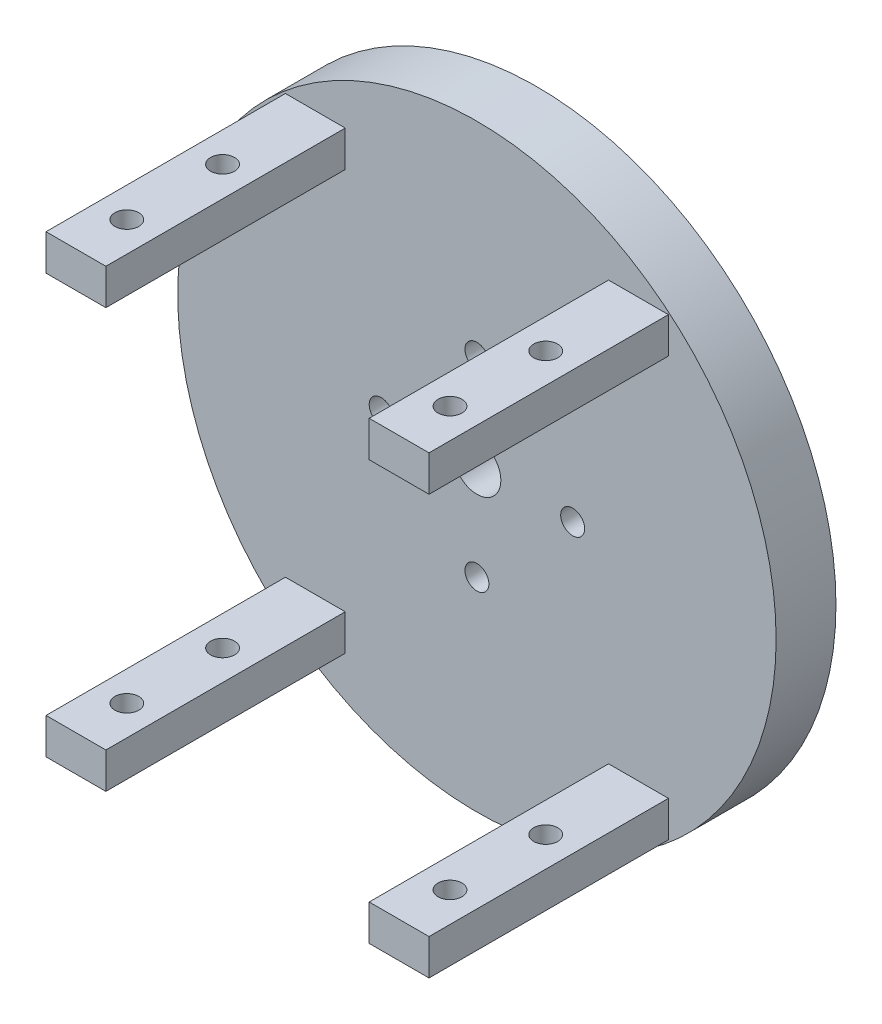
ISO-10303-21;
HEADER;
FILE_DESCRIPTION(('STEP AP214'),'2;1');
FILE_NAME('part.step','',(''),(''),'','','');
FILE_SCHEMA(('AUTOMOTIVE_DESIGN { 1 0 10303 214 1 1 1 1 }'));
ENDSEC;
DATA;
#1=APPLICATION_CONTEXT('core data for automotive mechanical design processes');
#2=APPLICATION_PROTOCOL_DEFINITION('international standard','automotive_design',2000,#1);
#3=PRODUCT_CONTEXT('',#1,'mechanical');
#4=PRODUCT('Part','Part','',(#3));
#5=PRODUCT_RELATED_PRODUCT_CATEGORY('part','',(#4));
#6=PRODUCT_DEFINITION_FORMATION('','',#4);
#7=PRODUCT_DEFINITION_CONTEXT('part definition',#1,'design');
#8=PRODUCT_DEFINITION('design','',#6,#7);
#9=PRODUCT_DEFINITION_SHAPE('','',#8);
#10=(LENGTH_UNIT() NAMED_UNIT(*) SI_UNIT(.MILLI.,.METRE.));
#11=(NAMED_UNIT(*) PLANE_ANGLE_UNIT() SI_UNIT($,.RADIAN.));
#12=(NAMED_UNIT(*) SI_UNIT($,.STERADIAN.) SOLID_ANGLE_UNIT());
#13=UNCERTAINTY_MEASURE_WITH_UNIT(LENGTH_MEASURE(1.E-05),#10,'distance_accuracy_value','');
#14=(GEOMETRIC_REPRESENTATION_CONTEXT(3) GLOBAL_UNCERTAINTY_ASSIGNED_CONTEXT((#13)) GLOBAL_UNIT_ASSIGNED_CONTEXT((#10,
#11,#12)) REPRESENTATION_CONTEXT('',''));
#15=CARTESIAN_POINT('',(0.,0.,0.));
#16=DIRECTION('',(0.,0.,1.));
#17=DIRECTION('',(1.,0.,0.));
#18=AXIS2_PLACEMENT_3D('',#15,#16,#17);
#19=CARTESIAN_POINT('',(2.25414240564596E-13,0.,5.));
#20=DIRECTION('',(0.,0.,1.));
#21=DIRECTION('',(1.,0.,0.));
#22=AXIS2_PLACEMENT_3D('',#19,#20,#21);
#23=PLANE('',#22);
#24=CARTESIAN_POINT('',(4.51808198568511E-13,-8.,5.));
#25=DIRECTION('',(0.,0.,1.));
#26=DIRECTION('',(1.,0.,0.));
#27=AXIS2_PLACEMENT_3D('',#24,#25,#26);
#28=CIRCLE('',#27,1.00000000000049);
#29=CARTESIAN_POINT('',(1.00000000000094,-8.,5.));
#30=VERTEX_POINT('',#29);
#31=EDGE_CURVE('E281',#30,#30,#28,.T.);
#32=ORIENTED_EDGE('',*,*,#31,.F.);
#33=EDGE_LOOP('',(#32));
#34=FACE_BOUND('',#33,.T.);
#35=CARTESIAN_POINT('',(0.,8.,5.));
#36=DIRECTION('',(0.,0.,1.));
#37=DIRECTION('',(1.,0.,0.));
#38=AXIS2_PLACEMENT_3D('',#35,#36,#37);
#39=CIRCLE('',#38,1.);
#40=CARTESIAN_POINT('',(1.,8.,5.));
#41=VERTEX_POINT('',#40);
#42=EDGE_CURVE('E293',#41,#41,#39,.T.);
#43=ORIENTED_EDGE('',*,*,#42,.F.);
#44=EDGE_LOOP('',(#43));
#45=FACE_BOUND('',#44,.T.);
#46=CARTESIAN_POINT('',(2.25414240564596E-13,0.,5.));
#47=DIRECTION('',(0.,0.,1.));
#48=DIRECTION('',(1.,0.,0.));
#49=AXIS2_PLACEMENT_3D('',#46,#47,#48);
#50=CIRCLE('',#49,25.);
#51=CARTESIAN_POINT('',(25.0000000000002,0.,5.));
#52=VERTEX_POINT('',#51);
#53=EDGE_CURVE('E11',#52,#52,#50,.T.);
#54=ORIENTED_EDGE('',*,*,#53,.T.);
#55=EDGE_LOOP('',(#54));
#56=FACE_BOUND('',#55,.T.);
#57=CARTESIAN_POINT('',(2.25414240564596E-13,0.,5.));
#58=DIRECTION('',(0.,0.,1.));
#59=DIRECTION('',(1.,0.,0.));
#60=AXIS2_PLACEMENT_3D('',#57,#58,#59);
#61=CIRCLE('',#60,2.);
#62=CARTESIAN_POINT('',(2.00000000000023,0.,5.));
#63=VERTEX_POINT('',#62);
#64=EDGE_CURVE('E299',#63,#63,#61,.T.);
#65=ORIENTED_EDGE('',*,*,#64,.F.);
#66=EDGE_LOOP('',(#65));
#67=FACE_BOUND('',#66,.T.);
#68=CARTESIAN_POINT('',(8.,0.,5.));
#69=DIRECTION('',(0.,0.,1.));
#70=DIRECTION('',(1.,0.,0.));
#71=AXIS2_PLACEMENT_3D('',#68,#69,#70);
#72=CIRCLE('',#71,1.);
#73=CARTESIAN_POINT('',(9.,0.,5.));
#74=VERTEX_POINT('',#73);
#75=EDGE_CURVE('E287',#74,#74,#72,.T.);
#76=ORIENTED_EDGE('',*,*,#75,.F.);
#77=EDGE_LOOP('',(#76));
#78=FACE_BOUND('',#77,.T.);
#79=CARTESIAN_POINT('',(-8.,0.,5.));
#80=DIRECTION('',(0.,0.,1.));
#81=DIRECTION('',(1.,0.,0.));
#82=AXIS2_PLACEMENT_3D('',#79,#80,#81);
#83=CIRCLE('',#82,1.);
#84=CARTESIAN_POINT('',(-7.,0.,5.));
#85=VERTEX_POINT('',#84);
#86=EDGE_CURVE('E275',#85,#85,#83,.T.);
#87=ORIENTED_EDGE('',*,*,#86,.F.);
#88=EDGE_LOOP('',(#87));
#89=FACE_BOUND('',#88,.T.);
#90=DIRECTION('',(1.,0.,0.));
#91=VECTOR('',#90,1.);
#92=CARTESIAN_POINT('',(11.0000000000002,-19.,5.));
#93=LINE('',#92,#91);
#94=CARTESIAN_POINT('',(11.0000000000002,-19.,5.));
#95=VERTEX_POINT('',#94);
#96=CARTESIAN_POINT('',(16.0000000000002,-19.,5.));
#97=VERTEX_POINT('',#96);
#98=EDGE_CURVE('E259',#95,#97,#93,.T.);
#99=ORIENTED_EDGE('',*,*,#98,.F.);
#100=DIRECTION('',(0.,-1.,0.));
#101=VECTOR('',#100,1.);
#102=CARTESIAN_POINT('',(11.0000000000002,-16.,5.));
#103=LINE('',#102,#101);
#104=CARTESIAN_POINT('',(11.0000000000002,-16.,5.));
#105=VERTEX_POINT('',#104);
#106=EDGE_CURVE('E238',#105,#95,#103,.T.);
#107=ORIENTED_EDGE('',*,*,#106,.F.);
#108=DIRECTION('',(-1.,0.,0.));
#109=VECTOR('',#108,1.);
#110=CARTESIAN_POINT('',(11.0000000000002,-16.,5.));
#111=LINE('',#110,#109);
#112=CARTESIAN_POINT('',(16.0000000000002,-16.,5.));
#113=VERTEX_POINT('',#112);
#114=EDGE_CURVE('E250',#113,#105,#111,.T.);
#115=ORIENTED_EDGE('',*,*,#114,.F.);
#116=DIRECTION('',(0.,1.,0.));
#117=VECTOR('',#116,1.);
#118=CARTESIAN_POINT('',(16.0000000000002,-19.,5.));
#119=LINE('',#118,#117);
#120=EDGE_CURVE('E261',#97,#113,#119,.T.);
#121=ORIENTED_EDGE('',*,*,#120,.F.);
#122=EDGE_LOOP('',(#99,#107,#115,#121));
#123=FACE_BOUND('',#122,.T.);
#124=DIRECTION('',(-1.,0.,0.));
#125=VECTOR('',#124,1.);
#126=CARTESIAN_POINT('',(-10.9999999999998,19.,5.));
#127=LINE('',#126,#125);
#128=CARTESIAN_POINT('',(-10.9999999999998,19.,5.));
#129=VERTEX_POINT('',#128);
#130=CARTESIAN_POINT('',(-15.9999999999998,19.,5.));
#131=VERTEX_POINT('',#130);
#132=EDGE_CURVE('E233',#129,#131,#127,.T.);
#133=ORIENTED_EDGE('',*,*,#132,.F.);
#134=DIRECTION('',(0.,1.,0.));
#135=VECTOR('',#134,1.);
#136=CARTESIAN_POINT('',(-10.9999999999998,19.,5.));
#137=LINE('',#136,#135);
#138=CARTESIAN_POINT('',(-10.9999999999998,16.,5.));
#139=VERTEX_POINT('',#138);
#140=EDGE_CURVE('E235',#139,#129,#137,.T.);
#141=ORIENTED_EDGE('',*,*,#140,.F.);
#142=DIRECTION('',(1.,0.,0.));
#143=VECTOR('',#142,1.);
#144=CARTESIAN_POINT('',(-15.9999999999998,16.,5.));
#145=LINE('',#144,#143);
#146=CARTESIAN_POINT('',(-15.9999999999998,16.,5.));
#147=VERTEX_POINT('',#146);
#148=EDGE_CURVE('E227',#147,#139,#145,.T.);
#149=ORIENTED_EDGE('',*,*,#148,.F.);
#150=DIRECTION('',(0.,-1.,0.));
#151=VECTOR('',#150,1.);
#152=CARTESIAN_POINT('',(-15.9999999999998,19.,5.));
#153=LINE('',#152,#151);
#154=EDGE_CURVE('E229',#131,#147,#153,.T.);
#155=ORIENTED_EDGE('',*,*,#154,.F.);
#156=EDGE_LOOP('',(#133,#141,#149,#155));
#157=FACE_BOUND('',#156,.T.);
#158=DIRECTION('',(-1.,0.,0.));
#159=VECTOR('',#158,1.);
#160=CARTESIAN_POINT('',(-15.9999999999998,-16.,5.));
#161=LINE('',#160,#159);
#162=CARTESIAN_POINT('',(-10.9999999999998,-16.,5.));
#163=VERTEX_POINT('',#162);
#164=CARTESIAN_POINT('',(-15.9999999999998,-16.,5.));
#165=VERTEX_POINT('',#164);
#166=EDGE_CURVE('E204',#163,#165,#161,.T.);
#167=ORIENTED_EDGE('',*,*,#166,.F.);
#168=DIRECTION('',(0.,1.,0.));
#169=VECTOR('',#168,1.);
#170=CARTESIAN_POINT('',(-10.9999999999998,-16.,5.));
#171=LINE('',#170,#169);
#172=CARTESIAN_POINT('',(-10.9999999999998,-19.,5.));
#173=VERTEX_POINT('',#172);
#174=EDGE_CURVE('E206',#173,#163,#171,.T.);
#175=ORIENTED_EDGE('',*,*,#174,.F.);
#176=DIRECTION('',(1.,0.,0.));
#177=VECTOR('',#176,1.);
#178=CARTESIAN_POINT('',(-15.9999999999998,-19.,5.));
#179=LINE('',#178,#177);
#180=CARTESIAN_POINT('',(-15.9999999999998,-19.,5.));
#181=VERTEX_POINT('',#180);
#182=EDGE_CURVE('E199',#181,#173,#179,.T.);
#183=ORIENTED_EDGE('',*,*,#182,.F.);
#184=DIRECTION('',(0.,-1.,0.));
#185=VECTOR('',#184,1.);
#186=CARTESIAN_POINT('',(-15.9999999999998,-16.,5.));
#187=LINE('',#186,#185);
#188=EDGE_CURVE('E201',#165,#181,#187,.T.);
#189=ORIENTED_EDGE('',*,*,#188,.F.);
#190=EDGE_LOOP('',(#167,#175,#183,#189));
#191=FACE_BOUND('',#190,.T.);
#192=DIRECTION('',(0.,-1.,0.));
#193=VECTOR('',#192,1.);
#194=CARTESIAN_POINT('',(11.0000000000002,19.,5.));
#195=LINE('',#194,#193);
#196=CARTESIAN_POINT('',(11.0000000000002,19.,5.));
#197=VERTEX_POINT('',#196);
#198=CARTESIAN_POINT('',(11.0000000000002,16.,5.));
#199=VERTEX_POINT('',#198);
#200=EDGE_CURVE('E178',#197,#199,#195,.T.);
#201=ORIENTED_EDGE('',*,*,#200,.F.);
#202=DIRECTION('',(-1.,0.,0.));
#203=VECTOR('',#202,1.);
#204=CARTESIAN_POINT('',(16.0000000000002,19.,5.));
#205=LINE('',#204,#203);
#206=CARTESIAN_POINT('',(16.0000000000002,19.,5.));
#207=VERTEX_POINT('',#206);
#208=EDGE_CURVE('E173',#207,#197,#205,.T.);
#209=ORIENTED_EDGE('',*,*,#208,.F.);
#210=DIRECTION('',(0.,1.,0.));
#211=VECTOR('',#210,1.);
#212=CARTESIAN_POINT('',(16.0000000000002,16.,5.));
#213=LINE('',#212,#211);
#214=CARTESIAN_POINT('',(16.0000000000002,16.,5.));
#215=VERTEX_POINT('',#214);
#216=EDGE_CURVE('E158',#215,#207,#213,.T.);
#217=ORIENTED_EDGE('',*,*,#216,.F.);
#218=DIRECTION('',(1.,0.,0.));
#219=VECTOR('',#218,1.);
#220=CARTESIAN_POINT('',(11.0000000000002,16.,5.));
#221=LINE('',#220,#219);
#222=EDGE_CURVE('E166',#199,#215,#221,.T.);
#223=ORIENTED_EDGE('',*,*,#222,.F.);
#224=EDGE_LOOP('',(#201,#209,#217,#223));
#225=FACE_BOUND('',#224,.T.);
#226=ADVANCED_FACE('F42',(#34,#45,#56,#67,#78,#89,#123,#157,#191,#225),#23,.T.);
#227=CARTESIAN_POINT('',(2.25414240564596E-13,0.,0.));
#228=DIRECTION('',(0.,0.,1.));
#229=DIRECTION('',(1.,0.,0.));
#230=AXIS2_PLACEMENT_3D('',#227,#228,#229);
#231=PLANE('',#230);
#232=CARTESIAN_POINT('',(2.25414240564596E-13,0.,0.));
#233=DIRECTION('',(0.,0.,1.));
#234=DIRECTION('',(1.,0.,0.));
#235=AXIS2_PLACEMENT_3D('',#232,#233,#234);
#236=CIRCLE('',#235,25.);
#237=CARTESIAN_POINT('',(25.0000000000002,0.,0.));
#238=VERTEX_POINT('',#237);
#239=EDGE_CURVE('E51',#238,#238,#236,.T.);
#240=ORIENTED_EDGE('',*,*,#239,.F.);
#241=EDGE_LOOP('',(#240));
#242=FACE_BOUND('',#241,.T.);
#243=CARTESIAN_POINT('',(2.25414240564596E-13,0.,0.));
#244=DIRECTION('',(0.,0.,1.));
#245=DIRECTION('',(1.,0.,0.));
#246=AXIS2_PLACEMENT_3D('',#243,#244,#245);
#247=CIRCLE('',#246,2.);
#248=CARTESIAN_POINT('',(2.00000000000023,0.,0.));
#249=VERTEX_POINT('',#248);
#250=EDGE_CURVE('E296',#249,#249,#247,.T.);
#251=ORIENTED_EDGE('',*,*,#250,.T.);
#252=EDGE_LOOP('',(#251));
#253=FACE_BOUND('',#252,.T.);
#254=CARTESIAN_POINT('',(0.,8.,0.));
#255=DIRECTION('',(0.,0.,1.));
#256=DIRECTION('',(1.,0.,0.));
#257=AXIS2_PLACEMENT_3D('',#254,#255,#256);
#258=CIRCLE('',#257,1.);
#259=CARTESIAN_POINT('',(1.,8.,0.));
#260=VERTEX_POINT('',#259);
#261=EDGE_CURVE('E290',#260,#260,#258,.T.);
#262=ORIENTED_EDGE('',*,*,#261,.T.);
#263=EDGE_LOOP('',(#262));
#264=FACE_BOUND('',#263,.T.);
#265=CARTESIAN_POINT('',(8.,0.,0.));
#266=DIRECTION('',(0.,0.,1.));
#267=DIRECTION('',(1.,0.,0.));
#268=AXIS2_PLACEMENT_3D('',#265,#266,#267);
#269=CIRCLE('',#268,1.);
#270=CARTESIAN_POINT('',(9.,0.,0.));
#271=VERTEX_POINT('',#270);
#272=EDGE_CURVE('E284',#271,#271,#269,.T.);
#273=ORIENTED_EDGE('',*,*,#272,.T.);
#274=EDGE_LOOP('',(#273));
#275=FACE_BOUND('',#274,.T.);
#276=CARTESIAN_POINT('',(4.51808198568511E-13,-8.,0.));
#277=DIRECTION('',(0.,0.,1.));
#278=DIRECTION('',(1.,0.,0.));
#279=AXIS2_PLACEMENT_3D('',#276,#277,#278);
#280=CIRCLE('',#279,1.00000000000049);
#281=CARTESIAN_POINT('',(1.00000000000094,-8.,0.));
#282=VERTEX_POINT('',#281);
#283=EDGE_CURVE('E278',#282,#282,#280,.T.);
#284=ORIENTED_EDGE('',*,*,#283,.T.);
#285=EDGE_LOOP('',(#284));
#286=FACE_BOUND('',#285,.T.);
#287=CARTESIAN_POINT('',(-8.,0.,0.));
#288=DIRECTION('',(0.,0.,1.));
#289=DIRECTION('',(1.,0.,0.));
#290=AXIS2_PLACEMENT_3D('',#287,#288,#289);
#291=CIRCLE('',#290,1.);
#292=CARTESIAN_POINT('',(-7.,0.,0.));
#293=VERTEX_POINT('',#292);
#294=EDGE_CURVE('E274',#293,#293,#291,.T.);
#295=ORIENTED_EDGE('',*,*,#294,.T.);
#296=EDGE_LOOP('',(#295));
#297=FACE_BOUND('',#296,.T.);
#298=ADVANCED_FACE('F377',(#242,#253,#264,#275,#286,#297),#231,.F.);
#299=CARTESIAN_POINT('',(2.25414240564596E-13,0.,5.));
#300=DIRECTION('',(0.,0.,-1.));
#301=DIRECTION('',(-1.,0.,0.));
#302=AXIS2_PLACEMENT_3D('',#299,#300,#301);
#303=CYLINDRICAL_SURFACE('',#302,25.);
#304=ORIENTED_EDGE('',*,*,#53,.F.);
#305=EDGE_LOOP('',(#304));
#306=FACE_BOUND('',#305,.T.);
#307=ORIENTED_EDGE('',*,*,#239,.T.);
#308=EDGE_LOOP('',(#307));
#309=FACE_BOUND('',#308,.T.);
#310=ADVANCED_FACE('F44',(#306,#309),#303,.T.);
#311=CARTESIAN_POINT('',(2.25414240564596E-13,0.,5.));
#312=DIRECTION('',(0.,0.,-1.));
#313=DIRECTION('',(-1.,0.,0.));
#314=AXIS2_PLACEMENT_3D('',#311,#312,#313);
#315=CYLINDRICAL_SURFACE('',#314,2.);
#316=ORIENTED_EDGE('',*,*,#64,.T.);
#317=EDGE_LOOP('',(#316));
#318=FACE_BOUND('',#317,.T.);
#319=ORIENTED_EDGE('',*,*,#250,.F.);
#320=EDGE_LOOP('',(#319));
#321=FACE_BOUND('',#320,.T.);
#322=ADVANCED_FACE('F387',(#318,#321),#315,.F.);
#323=CARTESIAN_POINT('',(0.,8.,5.));
#324=DIRECTION('',(0.,0.,-1.));
#325=DIRECTION('',(-1.,0.,0.));
#326=AXIS2_PLACEMENT_3D('',#323,#324,#325);
#327=CYLINDRICAL_SURFACE('',#326,1.);
#328=ORIENTED_EDGE('',*,*,#42,.T.);
#329=EDGE_LOOP('',(#328));
#330=FACE_BOUND('',#329,.T.);
#331=ORIENTED_EDGE('',*,*,#261,.F.);
#332=EDGE_LOOP('',(#331));
#333=FACE_BOUND('',#332,.T.);
#334=ADVANCED_FACE('F390',(#330,#333),#327,.F.);
#335=CARTESIAN_POINT('',(8.,0.,5.));
#336=DIRECTION('',(0.,0.,-1.));
#337=DIRECTION('',(-1.,0.,0.));
#338=AXIS2_PLACEMENT_3D('',#335,#336,#337);
#339=CYLINDRICAL_SURFACE('',#338,1.);
#340=ORIENTED_EDGE('',*,*,#75,.T.);
#341=EDGE_LOOP('',(#340));
#342=FACE_BOUND('',#341,.T.);
#343=ORIENTED_EDGE('',*,*,#272,.F.);
#344=EDGE_LOOP('',(#343));
#345=FACE_BOUND('',#344,.T.);
#346=ADVANCED_FACE('F394',(#342,#345),#339,.F.);
#347=CARTESIAN_POINT('',(4.51808198568511E-13,-8.,5.));
#348=DIRECTION('',(0.,0.,-1.));
#349=DIRECTION('',(-1.,0.,0.));
#350=AXIS2_PLACEMENT_3D('',#347,#348,#349);
#351=CYLINDRICAL_SURFACE('',#350,1.00000000000049);
#352=ORIENTED_EDGE('',*,*,#31,.T.);
#353=EDGE_LOOP('',(#352));
#354=FACE_BOUND('',#353,.T.);
#355=ORIENTED_EDGE('',*,*,#283,.F.);
#356=EDGE_LOOP('',(#355));
#357=FACE_BOUND('',#356,.T.);
#358=ADVANCED_FACE('F398',(#354,#357),#351,.F.);
#359=CARTESIAN_POINT('',(-8.,0.,5.));
#360=DIRECTION('',(0.,0.,-1.));
#361=DIRECTION('',(-1.,0.,0.));
#362=AXIS2_PLACEMENT_3D('',#359,#360,#361);
#363=CYLINDRICAL_SURFACE('',#362,1.);
#364=ORIENTED_EDGE('',*,*,#86,.T.);
#365=EDGE_LOOP('',(#364));
#366=FACE_BOUND('',#365,.T.);
#367=ORIENTED_EDGE('',*,*,#294,.F.);
#368=EDGE_LOOP('',(#367));
#369=FACE_BOUND('',#368,.T.);
#370=ADVANCED_FACE('F402',(#366,#369),#363,.F.);
#371=CARTESIAN_POINT('',(11.0000000000002,-16.,25.));
#372=DIRECTION('',(1.,0.,0.));
#373=DIRECTION('',(0.,1.,0.));
#374=AXIS2_PLACEMENT_3D('',#371,#372,#373);
#375=PLANE('',#374);
#376=ORIENTED_EDGE('',*,*,#106,.T.);
#377=DIRECTION('',(0.,0.,-1.));
#378=VECTOR('',#377,1.);
#379=CARTESIAN_POINT('',(11.0000000000002,-19.,25.));
#380=LINE('',#379,#378);
#381=CARTESIAN_POINT('',(11.0000000000002,-19.,25.));
#382=VERTEX_POINT('',#381);
#383=EDGE_CURVE('E272',#382,#95,#380,.T.);
#384=ORIENTED_EDGE('',*,*,#383,.F.);
#385=DIRECTION('',(0.,-1.,0.));
#386=VECTOR('',#385,1.);
#387=CARTESIAN_POINT('',(11.0000000000002,-16.,25.));
#388=LINE('',#387,#386);
#389=CARTESIAN_POINT('',(11.0000000000002,-16.,25.));
#390=VERTEX_POINT('',#389);
#391=EDGE_CURVE('E246',#390,#382,#388,.T.);
#392=ORIENTED_EDGE('',*,*,#391,.F.);
#393=DIRECTION('',(0.,0.,-1.));
#394=VECTOR('',#393,1.);
#395=CARTESIAN_POINT('',(11.0000000000002,-16.,25.));
#396=LINE('',#395,#394);
#397=EDGE_CURVE('E256',#390,#105,#396,.T.);
#398=ORIENTED_EDGE('',*,*,#397,.T.);
#399=EDGE_LOOP('',(#376,#384,#392,#398));
#400=FACE_BOUND('',#399,.T.);
#401=ADVANCED_FACE('F406',(#400),#375,.F.);
#402=CARTESIAN_POINT('',(11.0000000000002,-19.,25.));
#403=DIRECTION('',(0.,1.,0.));
#404=DIRECTION('',(-1.,0.,0.));
#405=AXIS2_PLACEMENT_3D('',#402,#403,#404);
#406=PLANE('',#405);
#407=CARTESIAN_POINT('',(13.5,-19.,20.75));
#408=DIRECTION('',(0.,-1.,0.));
#409=DIRECTION('',(0.,0.,-1.));
#410=AXIS2_PLACEMENT_3D('',#407,#408,#409);
#411=CIRCLE('',#410,1.);
#412=CARTESIAN_POINT('',(13.5,-19.,19.75));
#413=VERTEX_POINT('',#412);
#414=EDGE_CURVE('E320',#413,#413,#411,.T.);
#415=ORIENTED_EDGE('',*,*,#414,.F.);
#416=EDGE_LOOP('',(#415));
#417=FACE_BOUND('',#416,.T.);
#418=CARTESIAN_POINT('',(13.5,-19.,12.75));
#419=DIRECTION('',(0.,-1.,0.));
#420=DIRECTION('',(0.,0.,-1.));
#421=AXIS2_PLACEMENT_3D('',#418,#419,#420);
#422=CIRCLE('',#421,0.999999999999999);
#423=CARTESIAN_POINT('',(13.5,-19.,11.75));
#424=VERTEX_POINT('',#423);
#425=EDGE_CURVE('E732',#424,#424,#422,.T.);
#426=ORIENTED_EDGE('',*,*,#425,.F.);
#427=EDGE_LOOP('',(#426));
#428=FACE_BOUND('',#427,.T.);
#429=ORIENTED_EDGE('',*,*,#98,.T.);
#430=DIRECTION('',(0.,0.,-1.));
#431=VECTOR('',#430,1.);
#432=CARTESIAN_POINT('',(16.0000000000002,-19.,25.));
#433=LINE('',#432,#431);
#434=CARTESIAN_POINT('',(16.0000000000002,-19.,25.));
#435=VERTEX_POINT('',#434);
#436=EDGE_CURVE('E269',#435,#97,#433,.T.);
#437=ORIENTED_EDGE('',*,*,#436,.F.);
#438=DIRECTION('',(1.,0.,0.));
#439=VECTOR('',#438,1.);
#440=CARTESIAN_POINT('',(11.0000000000002,-19.,25.));
#441=LINE('',#440,#439);
#442=EDGE_CURVE('E249',#382,#435,#441,.T.);
#443=ORIENTED_EDGE('',*,*,#442,.F.);
#444=ORIENTED_EDGE('',*,*,#383,.T.);
#445=EDGE_LOOP('',(#429,#437,#443,#444));
#446=FACE_BOUND('',#445,.T.);
#447=ADVANCED_FACE('F410',(#417,#428,#446),#406,.F.);
#448=CARTESIAN_POINT('',(16.0000000000002,-19.,25.));
#449=DIRECTION('',(-1.,0.,0.));
#450=DIRECTION('',(0.,0.,1.));
#451=AXIS2_PLACEMENT_3D('',#448,#449,#450);
#452=PLANE('',#451);
#453=ORIENTED_EDGE('',*,*,#120,.T.);
#454=DIRECTION('',(0.,0.,-1.));
#455=VECTOR('',#454,1.);
#456=CARTESIAN_POINT('',(16.0000000000002,-16.,25.));
#457=LINE('',#456,#455);
#458=CARTESIAN_POINT('',(16.0000000000002,-16.,25.));
#459=VERTEX_POINT('',#458);
#460=EDGE_CURVE('E267',#459,#113,#457,.T.);
#461=ORIENTED_EDGE('',*,*,#460,.F.);
#462=DIRECTION('',(0.,1.,0.));
#463=VECTOR('',#462,1.);
#464=CARTESIAN_POINT('',(16.0000000000002,-19.,25.));
#465=LINE('',#464,#463);
#466=EDGE_CURVE('E252',#435,#459,#465,.T.);
#467=ORIENTED_EDGE('',*,*,#466,.F.);
#468=ORIENTED_EDGE('',*,*,#436,.T.);
#469=EDGE_LOOP('',(#453,#461,#467,#468));
#470=FACE_BOUND('',#469,.T.);
#471=ADVANCED_FACE('F414',(#470),#452,.F.);
#472=CARTESIAN_POINT('',(11.0000000000002,-16.,25.));
#473=DIRECTION('',(0.,-1.,0.));
#474=DIRECTION('',(1.,0.,0.));
#475=AXIS2_PLACEMENT_3D('',#472,#473,#474);
#476=PLANE('',#475);
#477=CARTESIAN_POINT('',(13.5,-16.,20.75));
#478=DIRECTION('',(0.,-1.,0.));
#479=DIRECTION('',(1.,0.,0.));
#480=AXIS2_PLACEMENT_3D('',#477,#478,#479);
#481=CIRCLE('',#480,1.);
#482=CARTESIAN_POINT('',(14.5,-16.,20.75));
#483=VERTEX_POINT('',#482);
#484=EDGE_CURVE('E329',#483,#483,#481,.T.);
#485=ORIENTED_EDGE('',*,*,#484,.T.);
#486=EDGE_LOOP('',(#485));
#487=FACE_BOUND('',#486,.T.);
#488=CARTESIAN_POINT('',(13.5,-16.,12.75));
#489=DIRECTION('',(0.,-1.,0.));
#490=DIRECTION('',(1.,0.,0.));
#491=AXIS2_PLACEMENT_3D('',#488,#489,#490);
#492=CIRCLE('',#491,0.999999999999999);
#493=CARTESIAN_POINT('',(14.5,-16.,12.75));
#494=VERTEX_POINT('',#493);
#495=EDGE_CURVE('E312',#494,#494,#492,.T.);
#496=ORIENTED_EDGE('',*,*,#495,.T.);
#497=EDGE_LOOP('',(#496));
#498=FACE_BOUND('',#497,.T.);
#499=ORIENTED_EDGE('',*,*,#114,.T.);
#500=ORIENTED_EDGE('',*,*,#397,.F.);
#501=DIRECTION('',(-1.,0.,0.));
#502=VECTOR('',#501,1.);
#503=CARTESIAN_POINT('',(11.0000000000002,-16.,25.));
#504=LINE('',#503,#502);
#505=EDGE_CURVE('E254',#459,#390,#504,.T.);
#506=ORIENTED_EDGE('',*,*,#505,.F.);
#507=ORIENTED_EDGE('',*,*,#460,.T.);
#508=EDGE_LOOP('',(#499,#500,#506,#507));
#509=FACE_BOUND('',#508,.T.);
#510=ADVANCED_FACE('F418',(#487,#498,#509),#476,.F.);
#511=CARTESIAN_POINT('',(0.,0.,25.));
#512=DIRECTION('',(0.,0.,1.));
#513=DIRECTION('',(1.,0.,0.));
#514=AXIS2_PLACEMENT_3D('',#511,#512,#513);
#515=PLANE('',#514);
#516=ORIENTED_EDGE('',*,*,#391,.T.);
#517=ORIENTED_EDGE('',*,*,#442,.T.);
#518=ORIENTED_EDGE('',*,*,#466,.T.);
#519=ORIENTED_EDGE('',*,*,#505,.T.);
#520=EDGE_LOOP('',(#516,#517,#518,#519));
#521=FACE_BOUND('',#520,.T.);
#522=ADVANCED_FACE('F422',(#521),#515,.T.);
#523=CARTESIAN_POINT('',(-10.9999999999998,19.,25.));
#524=DIRECTION('',(-1.,0.,0.));
#525=DIRECTION('',(0.,-1.,0.));
#526=AXIS2_PLACEMENT_3D('',#523,#524,#525);
#527=PLANE('',#526);
#528=ORIENTED_EDGE('',*,*,#140,.T.);
#529=DIRECTION('',(0.,0.,-1.));
#530=VECTOR('',#529,1.);
#531=CARTESIAN_POINT('',(-10.9999999999998,19.,25.));
#532=LINE('',#531,#530);
#533=CARTESIAN_POINT('',(-10.9999999999998,19.,25.));
#534=VERTEX_POINT('',#533);
#535=EDGE_CURVE('E209',#534,#129,#532,.T.);
#536=ORIENTED_EDGE('',*,*,#535,.F.);
#537=DIRECTION('',(0.,1.,0.));
#538=VECTOR('',#537,1.);
#539=CARTESIAN_POINT('',(-10.9999999999998,19.,25.));
#540=LINE('',#539,#538);
#541=CARTESIAN_POINT('',(-10.9999999999998,16.,25.));
#542=VERTEX_POINT('',#541);
#543=EDGE_CURVE('E230',#542,#534,#540,.T.);
#544=ORIENTED_EDGE('',*,*,#543,.F.);
#545=DIRECTION('',(0.,0.,-1.));
#546=VECTOR('',#545,1.);
#547=CARTESIAN_POINT('',(-10.9999999999998,16.,25.));
#548=LINE('',#547,#546);
#549=EDGE_CURVE('E223',#542,#139,#548,.T.);
#550=ORIENTED_EDGE('',*,*,#549,.T.);
#551=EDGE_LOOP('',(#528,#536,#544,#550));
#552=FACE_BOUND('',#551,.T.);
#553=ADVANCED_FACE('F426',(#552),#527,.F.);
#554=CARTESIAN_POINT('',(-10.9999999999998,19.,25.));
#555=DIRECTION('',(0.,-1.,0.));
#556=DIRECTION('',(0.,0.,-1.));
#557=AXIS2_PLACEMENT_3D('',#554,#555,#556);
#558=PLANE('',#557);
#559=CARTESIAN_POINT('',(-13.5,19.,12.75));
#560=DIRECTION('',(0.,-1.,0.));
#561=DIRECTION('',(0.,0.,-1.));
#562=AXIS2_PLACEMENT_3D('',#559,#560,#561);
#563=CIRCLE('',#562,1.);
#564=CARTESIAN_POINT('',(-13.5,19.,11.75));
#565=VERTEX_POINT('',#564);
#566=EDGE_CURVE('E347',#565,#565,#563,.T.);
#567=ORIENTED_EDGE('',*,*,#566,.T.);
#568=EDGE_LOOP('',(#567));
#569=FACE_BOUND('',#568,.T.);
#570=CARTESIAN_POINT('',(-13.5,19.,20.75));
#571=DIRECTION('',(0.,-1.,0.));
#572=DIRECTION('',(0.,0.,-1.));
#573=AXIS2_PLACEMENT_3D('',#570,#571,#572);
#574=CIRCLE('',#573,1.);
#575=CARTESIAN_POINT('',(-13.5,19.,19.75));
#576=VERTEX_POINT('',#575);
#577=EDGE_CURVE('E338',#576,#576,#574,.T.);
#578=ORIENTED_EDGE('',*,*,#577,.T.);
#579=EDGE_LOOP('',(#578));
#580=FACE_BOUND('',#579,.T.);
#581=ORIENTED_EDGE('',*,*,#132,.T.);
#582=DIRECTION('',(0.,0.,-1.));
#583=VECTOR('',#582,1.);
#584=CARTESIAN_POINT('',(-15.9999999999998,19.,25.));
#585=LINE('',#584,#583);
#586=CARTESIAN_POINT('',(-15.9999999999998,19.,25.));
#587=VERTEX_POINT('',#586);
#588=EDGE_CURVE('E218',#587,#131,#585,.T.);
#589=ORIENTED_EDGE('',*,*,#588,.F.);
#590=DIRECTION('',(-1.,0.,0.));
#591=VECTOR('',#590,1.);
#592=CARTESIAN_POINT('',(-10.9999999999998,19.,25.));
#593=LINE('',#592,#591);
#594=EDGE_CURVE('E242',#534,#587,#593,.T.);
#595=ORIENTED_EDGE('',*,*,#594,.F.);
#596=ORIENTED_EDGE('',*,*,#535,.T.);
#597=EDGE_LOOP('',(#581,#589,#595,#596));
#598=FACE_BOUND('',#597,.T.);
#599=ADVANCED_FACE('F440',(#569,#580,#598),#558,.F.);
#600=CARTESIAN_POINT('',(-15.9999999999998,19.,25.));
#601=DIRECTION('',(1.,0.,0.));
#602=DIRECTION('',(0.,0.,-1.));
#603=AXIS2_PLACEMENT_3D('',#600,#601,#602);
#604=PLANE('',#603);
#605=ORIENTED_EDGE('',*,*,#154,.T.);
#606=DIRECTION('',(0.,0.,-1.));
#607=VECTOR('',#606,1.);
#608=CARTESIAN_POINT('',(-15.9999999999998,16.,25.));
#609=LINE('',#608,#607);
#610=CARTESIAN_POINT('',(-15.9999999999998,16.,25.));
#611=VERTEX_POINT('',#610);
#612=EDGE_CURVE('E221',#611,#147,#609,.T.);
#613=ORIENTED_EDGE('',*,*,#612,.F.);
#614=DIRECTION('',(0.,-1.,0.));
#615=VECTOR('',#614,1.);
#616=CARTESIAN_POINT('',(-15.9999999999998,19.,25.));
#617=LINE('',#616,#615);
#618=EDGE_CURVE('E240',#587,#611,#617,.T.);
#619=ORIENTED_EDGE('',*,*,#618,.F.);
#620=ORIENTED_EDGE('',*,*,#588,.T.);
#621=EDGE_LOOP('',(#605,#613,#619,#620));
#622=FACE_BOUND('',#621,.T.);
#623=ADVANCED_FACE('F436',(#622),#604,.F.);
#624=CARTESIAN_POINT('',(-15.9999999999998,16.,25.));
#625=DIRECTION('',(0.,1.,0.));
#626=DIRECTION('',(-1.,0.,0.));
#627=AXIS2_PLACEMENT_3D('',#624,#625,#626);
#628=PLANE('',#627);
#629=CARTESIAN_POINT('',(-13.5,16.,12.75));
#630=DIRECTION('',(0.,1.,0.));
#631=DIRECTION('',(-1.,0.,0.));
#632=AXIS2_PLACEMENT_3D('',#629,#630,#631);
#633=CIRCLE('',#632,1.);
#634=CARTESIAN_POINT('',(-14.5,16.,12.75));
#635=VERTEX_POINT('',#634);
#636=EDGE_CURVE('E344',#635,#635,#633,.T.);
#637=ORIENTED_EDGE('',*,*,#636,.T.);
#638=EDGE_LOOP('',(#637));
#639=FACE_BOUND('',#638,.T.);
#640=CARTESIAN_POINT('',(-13.5,16.,20.75));
#641=DIRECTION('',(0.,1.,0.));
#642=DIRECTION('',(-1.,0.,0.));
#643=AXIS2_PLACEMENT_3D('',#640,#641,#642);
#644=CIRCLE('',#643,1.);
#645=CARTESIAN_POINT('',(-14.5,16.,20.75));
#646=VERTEX_POINT('',#645);
#647=EDGE_CURVE('E335',#646,#646,#644,.T.);
#648=ORIENTED_EDGE('',*,*,#647,.T.);
#649=EDGE_LOOP('',(#648));
#650=FACE_BOUND('',#649,.T.);
#651=ORIENTED_EDGE('',*,*,#148,.T.);
#652=ORIENTED_EDGE('',*,*,#549,.F.);
#653=DIRECTION('',(1.,0.,0.));
#654=VECTOR('',#653,1.);
#655=CARTESIAN_POINT('',(-15.9999999999998,16.,25.));
#656=LINE('',#655,#654);
#657=EDGE_CURVE('E226',#611,#542,#656,.T.);
#658=ORIENTED_EDGE('',*,*,#657,.F.);
#659=ORIENTED_EDGE('',*,*,#612,.T.);
#660=EDGE_LOOP('',(#651,#652,#658,#659));
#661=FACE_BOUND('',#660,.T.);
#662=ADVANCED_FACE('F432',(#639,#650,#661),#628,.F.);
#663=CARTESIAN_POINT('',(0.,0.,25.));
#664=DIRECTION('',(0.,0.,1.));
#665=DIRECTION('',(1.,0.,0.));
#666=AXIS2_PLACEMENT_3D('',#663,#664,#665);
#667=PLANE('',#666);
#668=ORIENTED_EDGE('',*,*,#543,.T.);
#669=ORIENTED_EDGE('',*,*,#594,.T.);
#670=ORIENTED_EDGE('',*,*,#618,.T.);
#671=ORIENTED_EDGE('',*,*,#657,.T.);
#672=EDGE_LOOP('',(#668,#669,#670,#671));
#673=FACE_BOUND('',#672,.T.);
#674=ADVANCED_FACE('F428',(#673),#667,.T.);
#675=CARTESIAN_POINT('',(-10.9999999999998,-16.,25.));
#676=DIRECTION('',(-1.,0.,0.));
#677=DIRECTION('',(0.,-1.,0.));
#678=AXIS2_PLACEMENT_3D('',#675,#676,#677);
#679=PLANE('',#678);
#680=ORIENTED_EDGE('',*,*,#174,.T.);
#681=DIRECTION('',(0.,0.,-1.));
#682=VECTOR('',#681,1.);
#683=CARTESIAN_POINT('',(-10.9999999999998,-16.,25.));
#684=LINE('',#683,#682);
#685=CARTESIAN_POINT('',(-10.9999999999998,-16.,25.));
#686=VERTEX_POINT('',#685);
#687=EDGE_CURVE('E179',#686,#163,#684,.T.);
#688=ORIENTED_EDGE('',*,*,#687,.F.);
#689=DIRECTION('',(0.,1.,0.));
#690=VECTOR('',#689,1.);
#691=CARTESIAN_POINT('',(-10.9999999999998,-16.,25.));
#692=LINE('',#691,#690);
#693=CARTESIAN_POINT('',(-10.9999999999998,-19.,25.));
#694=VERTEX_POINT('',#693);
#695=EDGE_CURVE('E202',#694,#686,#692,.T.);
#696=ORIENTED_EDGE('',*,*,#695,.F.);
#697=DIRECTION('',(0.,0.,-1.));
#698=VECTOR('',#697,1.);
#699=CARTESIAN_POINT('',(-10.9999999999998,-19.,25.));
#700=LINE('',#699,#698);
#701=EDGE_CURVE('E195',#694,#173,#700,.T.);
#702=ORIENTED_EDGE('',*,*,#701,.T.);
#703=EDGE_LOOP('',(#680,#688,#696,#702));
#704=FACE_BOUND('',#703,.T.);
#705=ADVANCED_FACE('F431',(#704),#679,.F.);
#706=CARTESIAN_POINT('',(-15.9999999999998,-16.,25.));
#707=DIRECTION('',(0.,-1.,0.));
#708=DIRECTION('',(1.,0.,0.));
#709=AXIS2_PLACEMENT_3D('',#706,#707,#708);
#710=PLANE('',#709);
#711=CARTESIAN_POINT('',(-13.5,-16.,12.75));
#712=DIRECTION('',(0.,-1.,0.));
#713=DIRECTION('',(1.,0.,0.));
#714=AXIS2_PLACEMENT_3D('',#711,#712,#713);
#715=CIRCLE('',#714,1.);
#716=CARTESIAN_POINT('',(-12.5,-16.,12.75));
#717=VERTEX_POINT('',#716);
#718=EDGE_CURVE('E341',#717,#717,#715,.T.);
#719=ORIENTED_EDGE('',*,*,#718,.T.);
#720=EDGE_LOOP('',(#719));
#721=FACE_BOUND('',#720,.T.);
#722=CARTESIAN_POINT('',(-13.5,-16.,20.75));
#723=DIRECTION('',(0.,-1.,0.));
#724=DIRECTION('',(1.,0.,0.));
#725=AXIS2_PLACEMENT_3D('',#722,#723,#724);
#726=CIRCLE('',#725,1.);
#727=CARTESIAN_POINT('',(-12.5,-16.,20.75));
#728=VERTEX_POINT('',#727);
#729=EDGE_CURVE('E332',#728,#728,#726,.T.);
#730=ORIENTED_EDGE('',*,*,#729,.T.);
#731=EDGE_LOOP('',(#730));
#732=FACE_BOUND('',#731,.T.);
#733=ORIENTED_EDGE('',*,*,#166,.T.);
#734=DIRECTION('',(0.,0.,-1.));
#735=VECTOR('',#734,1.);
#736=CARTESIAN_POINT('',(-15.9999999999998,-16.,25.));
#737=LINE('',#736,#735);
#738=CARTESIAN_POINT('',(-15.9999999999998,-16.,25.));
#739=VERTEX_POINT('',#738);
#740=EDGE_CURVE('E181',#739,#165,#737,.T.);
#741=ORIENTED_EDGE('',*,*,#740,.F.);
#742=DIRECTION('',(-1.,0.,0.));
#743=VECTOR('',#742,1.);
#744=CARTESIAN_POINT('',(-15.9999999999998,-16.,25.));
#745=LINE('',#744,#743);
#746=EDGE_CURVE('E213',#686,#739,#745,.T.);
#747=ORIENTED_EDGE('',*,*,#746,.F.);
#748=ORIENTED_EDGE('',*,*,#687,.T.);
#749=EDGE_LOOP('',(#733,#741,#747,#748));
#750=FACE_BOUND('',#749,.T.);
#751=ADVANCED_FACE('F459',(#721,#732,#750),#710,.F.);
#752=CARTESIAN_POINT('',(-15.9999999999998,-16.,25.));
#753=DIRECTION('',(1.,0.,0.));
#754=DIRECTION('',(0.,0.,-1.));
#755=AXIS2_PLACEMENT_3D('',#752,#753,#754);
#756=PLANE('',#755);
#757=ORIENTED_EDGE('',*,*,#188,.T.);
#758=DIRECTION('',(0.,0.,-1.));
#759=VECTOR('',#758,1.);
#760=CARTESIAN_POINT('',(-15.9999999999998,-19.,25.));
#761=LINE('',#760,#759);
#762=CARTESIAN_POINT('',(-15.9999999999998,-19.,25.));
#763=VERTEX_POINT('',#762);
#764=EDGE_CURVE('E67',#763,#181,#761,.T.);
#765=ORIENTED_EDGE('',*,*,#764,.F.);
#766=DIRECTION('',(0.,-1.,0.));
#767=VECTOR('',#766,1.);
#768=CARTESIAN_POINT('',(-15.9999999999998,-16.,25.));
#769=LINE('',#768,#767);
#770=EDGE_CURVE('E211',#739,#763,#769,.T.);
#771=ORIENTED_EDGE('',*,*,#770,.F.);
#772=ORIENTED_EDGE('',*,*,#740,.T.);
#773=EDGE_LOOP('',(#757,#765,#771,#772));
#774=FACE_BOUND('',#773,.T.);
#775=ADVANCED_FACE('F455',(#774),#756,.F.);
#776=CARTESIAN_POINT('',(-15.9999999999998,-19.,25.));
#777=DIRECTION('',(0.,1.,0.));
#778=DIRECTION('',(-1.,0.,0.));
#779=AXIS2_PLACEMENT_3D('',#776,#777,#778);
#780=PLANE('',#779);
#781=CARTESIAN_POINT('',(-13.5,-19.,12.75));
#782=DIRECTION('',(0.,-1.,0.));
#783=DIRECTION('',(0.,0.,-1.));
#784=AXIS2_PLACEMENT_3D('',#781,#782,#783);
#785=CIRCLE('',#784,1.);
#786=CARTESIAN_POINT('',(-13.5,-19.,11.75));
#787=VERTEX_POINT('',#786);
#788=EDGE_CURVE('E315',#787,#787,#785,.T.);
#789=ORIENTED_EDGE('',*,*,#788,.F.);
#790=EDGE_LOOP('',(#789));
#791=FACE_BOUND('',#790,.T.);
#792=CARTESIAN_POINT('',(-13.5,-19.,20.75));
#793=DIRECTION('',(0.,-1.,0.));
#794=DIRECTION('',(0.,0.,-1.));
#795=AXIS2_PLACEMENT_3D('',#792,#793,#794);
#796=CIRCLE('',#795,1.);
#797=CARTESIAN_POINT('',(-13.5,-19.,19.75));
#798=VERTEX_POINT('',#797);
#799=EDGE_CURVE('E308',#798,#798,#796,.T.);
#800=ORIENTED_EDGE('',*,*,#799,.F.);
#801=EDGE_LOOP('',(#800));
#802=FACE_BOUND('',#801,.T.);
#803=ORIENTED_EDGE('',*,*,#182,.T.);
#804=ORIENTED_EDGE('',*,*,#701,.F.);
#805=DIRECTION('',(1.,0.,0.));
#806=VECTOR('',#805,1.);
#807=CARTESIAN_POINT('',(-15.9999999999998,-19.,25.));
#808=LINE('',#807,#806);
#809=EDGE_CURVE('E198',#763,#694,#808,.T.);
#810=ORIENTED_EDGE('',*,*,#809,.F.);
#811=ORIENTED_EDGE('',*,*,#764,.T.);
#812=EDGE_LOOP('',(#803,#804,#810,#811));
#813=FACE_BOUND('',#812,.T.);
#814=ADVANCED_FACE('F451',(#791,#802,#813),#780,.F.);
#815=CARTESIAN_POINT('',(0.,0.,25.));
#816=DIRECTION('',(0.,0.,1.));
#817=DIRECTION('',(1.,0.,0.));
#818=AXIS2_PLACEMENT_3D('',#815,#816,#817);
#819=PLANE('',#818);
#820=ORIENTED_EDGE('',*,*,#695,.T.);
#821=ORIENTED_EDGE('',*,*,#746,.T.);
#822=ORIENTED_EDGE('',*,*,#770,.T.);
#823=ORIENTED_EDGE('',*,*,#809,.T.);
#824=EDGE_LOOP('',(#820,#821,#822,#823));
#825=FACE_BOUND('',#824,.T.);
#826=ADVANCED_FACE('F448',(#825),#819,.T.);
#827=CARTESIAN_POINT('',(16.0000000000002,19.,25.));
#828=DIRECTION('',(0.,-1.,0.));
#829=DIRECTION('',(1.,0.,0.));
#830=AXIS2_PLACEMENT_3D('',#827,#828,#829);
#831=PLANE('',#830);
#832=CARTESIAN_POINT('',(13.5,19.,20.75));
#833=DIRECTION('',(0.,-1.,0.));
#834=DIRECTION('',(1.,0.,0.));
#835=AXIS2_PLACEMENT_3D('',#832,#833,#834);
#836=CIRCLE('',#835,1.);
#837=CARTESIAN_POINT('',(14.5,19.,20.75));
#838=VERTEX_POINT('',#837);
#839=EDGE_CURVE('E326',#838,#838,#836,.T.);
#840=ORIENTED_EDGE('',*,*,#839,.T.);
#841=EDGE_LOOP('',(#840));
#842=FACE_BOUND('',#841,.T.);
#843=CARTESIAN_POINT('',(13.5,19.,12.75));
#844=DIRECTION('',(0.,-1.,0.));
#845=DIRECTION('',(1.,0.,0.));
#846=AXIS2_PLACEMENT_3D('',#843,#844,#845);
#847=CIRCLE('',#846,0.999999999999999);
#848=CARTESIAN_POINT('',(14.5,19.,12.75));
#849=VERTEX_POINT('',#848);
#850=EDGE_CURVE('E307',#849,#849,#847,.T.);
#851=ORIENTED_EDGE('',*,*,#850,.T.);
#852=EDGE_LOOP('',(#851));
#853=FACE_BOUND('',#852,.T.);
#854=ORIENTED_EDGE('',*,*,#208,.T.);
#855=DIRECTION('',(0.,0.,-1.));
#856=VECTOR('',#855,1.);
#857=CARTESIAN_POINT('',(11.0000000000002,19.,25.));
#858=LINE('',#857,#856);
#859=CARTESIAN_POINT('',(11.0000000000002,19.,25.));
#860=VERTEX_POINT('',#859);
#861=EDGE_CURVE('E350',#860,#197,#858,.T.);
#862=ORIENTED_EDGE('',*,*,#861,.F.);
#863=DIRECTION('',(-1.,0.,0.));
#864=VECTOR('',#863,1.);
#865=CARTESIAN_POINT('',(16.0000000000002,19.,25.));
#866=LINE('',#865,#864);
#867=CARTESIAN_POINT('',(16.0000000000002,19.,25.));
#868=VERTEX_POINT('',#867);
#869=EDGE_CURVE('E167',#868,#860,#866,.T.);
#870=ORIENTED_EDGE('',*,*,#869,.F.);
#871=DIRECTION('',(0.,0.,-1.));
#872=VECTOR('',#871,1.);
#873=CARTESIAN_POINT('',(16.0000000000002,19.,25.));
#874=LINE('',#873,#872);
#875=EDGE_CURVE('E161',#868,#207,#874,.T.);
#876=ORIENTED_EDGE('',*,*,#875,.T.);
#877=EDGE_LOOP('',(#854,#862,#870,#876));
#878=FACE_BOUND('',#877,.T.);
#879=ADVANCED_FACE('F171',(#842,#853,#878),#831,.F.);
#880=CARTESIAN_POINT('',(11.0000000000002,19.,25.));
#881=DIRECTION('',(1.,0.,0.));
#882=DIRECTION('',(0.,0.,-1.));
#883=AXIS2_PLACEMENT_3D('',#880,#881,#882);
#884=PLANE('',#883);
#885=ORIENTED_EDGE('',*,*,#200,.T.);
#886=DIRECTION('',(0.,0.,-1.));
#887=VECTOR('',#886,1.);
#888=CARTESIAN_POINT('',(11.0000000000002,16.,25.));
#889=LINE('',#888,#887);
#890=CARTESIAN_POINT('',(11.0000000000002,16.,25.));
#891=VERTEX_POINT('',#890);
#892=EDGE_CURVE('E352',#891,#199,#889,.T.);
#893=ORIENTED_EDGE('',*,*,#892,.F.);
#894=DIRECTION('',(0.,-1.,0.));
#895=VECTOR('',#894,1.);
#896=CARTESIAN_POINT('',(11.0000000000002,19.,25.));
#897=LINE('',#896,#895);
#898=EDGE_CURVE('E189',#860,#891,#897,.T.);
#899=ORIENTED_EDGE('',*,*,#898,.F.);
#900=ORIENTED_EDGE('',*,*,#861,.T.);
#901=EDGE_LOOP('',(#885,#893,#899,#900));
#902=FACE_BOUND('',#901,.T.);
#903=ADVANCED_FACE('F360',(#902),#884,.F.);
#904=CARTESIAN_POINT('',(11.0000000000002,16.,25.));
#905=DIRECTION('',(0.,1.,0.));
#906=DIRECTION('',(-1.,0.,0.));
#907=AXIS2_PLACEMENT_3D('',#904,#905,#906);
#908=PLANE('',#907);
#909=CARTESIAN_POINT('',(13.5,16.,20.75));
#910=DIRECTION('',(0.,1.,0.));
#911=DIRECTION('',(-1.,0.,0.));
#912=AXIS2_PLACEMENT_3D('',#909,#910,#911);
#913=CIRCLE('',#912,1.);
#914=CARTESIAN_POINT('',(12.5,16.,20.75));
#915=VERTEX_POINT('',#914);
#916=EDGE_CURVE('E46',#915,#915,#913,.T.);
#917=ORIENTED_EDGE('',*,*,#916,.T.);
#918=EDGE_LOOP('',(#917));
#919=FACE_BOUND('',#918,.T.);
#920=CARTESIAN_POINT('',(13.5,16.,12.75));
#921=DIRECTION('',(0.,1.,0.));
#922=DIRECTION('',(-1.,0.,0.));
#923=AXIS2_PLACEMENT_3D('',#920,#921,#922);
#924=CIRCLE('',#923,0.999999999999999);
#925=CARTESIAN_POINT('',(12.5,16.,12.75));
#926=VERTEX_POINT('',#925);
#927=EDGE_CURVE('E305',#926,#926,#924,.T.);
#928=ORIENTED_EDGE('',*,*,#927,.T.);
#929=EDGE_LOOP('',(#928));
#930=FACE_BOUND('',#929,.T.);
#931=ORIENTED_EDGE('',*,*,#222,.T.);
#932=DIRECTION('',(0.,0.,-1.));
#933=VECTOR('',#932,1.);
#934=CARTESIAN_POINT('',(16.0000000000002,16.,25.));
#935=LINE('',#934,#933);
#936=CARTESIAN_POINT('',(16.0000000000002,16.,25.));
#937=VERTEX_POINT('',#936);
#938=EDGE_CURVE('E59',#937,#215,#935,.T.);
#939=ORIENTED_EDGE('',*,*,#938,.F.);
#940=DIRECTION('',(1.,0.,0.));
#941=VECTOR('',#940,1.);
#942=CARTESIAN_POINT('',(11.0000000000002,16.,25.));
#943=LINE('',#942,#941);
#944=EDGE_CURVE('E187',#891,#937,#943,.T.);
#945=ORIENTED_EDGE('',*,*,#944,.F.);
#946=ORIENTED_EDGE('',*,*,#892,.T.);
#947=EDGE_LOOP('',(#931,#939,#945,#946));
#948=FACE_BOUND('',#947,.T.);
#949=ADVANCED_FACE('F356',(#919,#930,#948),#908,.F.);
#950=CARTESIAN_POINT('',(16.0000000000002,16.,25.));
#951=DIRECTION('',(-1.,0.,0.));
#952=DIRECTION('',(0.,0.,1.));
#953=AXIS2_PLACEMENT_3D('',#950,#951,#952);
#954=PLANE('',#953);
#955=ORIENTED_EDGE('',*,*,#216,.T.);
#956=ORIENTED_EDGE('',*,*,#875,.F.);
#957=DIRECTION('',(0.,1.,0.));
#958=VECTOR('',#957,1.);
#959=CARTESIAN_POINT('',(16.0000000000002,16.,25.));
#960=LINE('',#959,#958);
#961=EDGE_CURVE('E176',#937,#868,#960,.T.);
#962=ORIENTED_EDGE('',*,*,#961,.F.);
#963=ORIENTED_EDGE('',*,*,#938,.T.);
#964=EDGE_LOOP('',(#955,#956,#962,#963));
#965=FACE_BOUND('',#964,.T.);
#966=ADVANCED_FACE('F160',(#965),#954,.F.);
#967=CARTESIAN_POINT('',(0.,0.,25.));
#968=DIRECTION('',(0.,0.,1.));
#969=DIRECTION('',(1.,0.,0.));
#970=AXIS2_PLACEMENT_3D('',#967,#968,#969);
#971=PLANE('',#970);
#972=ORIENTED_EDGE('',*,*,#869,.T.);
#973=ORIENTED_EDGE('',*,*,#898,.T.);
#974=ORIENTED_EDGE('',*,*,#944,.T.);
#975=ORIENTED_EDGE('',*,*,#961,.T.);
#976=EDGE_LOOP('',(#972,#973,#974,#975));
#977=FACE_BOUND('',#976,.T.);
#978=ADVANCED_FACE('F362',(#977),#971,.T.);
#979=CARTESIAN_POINT('',(13.5,25.,12.75));
#980=DIRECTION('',(0.,-1.,0.));
#981=DIRECTION('',(0.,0.,-1.));
#982=AXIS2_PLACEMENT_3D('',#979,#980,#981);
#983=CYLINDRICAL_SURFACE('',#982,0.999999999999999);
#984=ORIENTED_EDGE('',*,*,#927,.F.);
#985=EDGE_LOOP('',(#984));
#986=FACE_BOUND('',#985,.T.);
#987=ORIENTED_EDGE('',*,*,#850,.F.);
#988=EDGE_LOOP('',(#987));
#989=FACE_BOUND('',#988,.T.);
#990=ADVANCED_FACE('F364',(#986,#989),#983,.F.);
#991=CARTESIAN_POINT('',(13.5,25.,20.75));
#992=DIRECTION('',(0.,-1.,0.));
#993=DIRECTION('',(0.,0.,-1.));
#994=AXIS2_PLACEMENT_3D('',#991,#992,#993);
#995=CYLINDRICAL_SURFACE('',#994,1.);
#996=ORIENTED_EDGE('',*,*,#916,.F.);
#997=EDGE_LOOP('',(#996));
#998=FACE_BOUND('',#997,.T.);
#999=ORIENTED_EDGE('',*,*,#839,.F.);
#1000=EDGE_LOOP('',(#999));
#1001=FACE_BOUND('',#1000,.T.);
#1002=ADVANCED_FACE('F370',(#998,#1001),#995,.F.);
#1003=CARTESIAN_POINT('',(-13.5,25.,20.75));
#1004=DIRECTION('',(0.,-1.,0.));
#1005=DIRECTION('',(0.,0.,-1.));
#1006=AXIS2_PLACEMENT_3D('',#1003,#1004,#1005);
#1007=CYLINDRICAL_SURFACE('',#1006,1.);
#1008=ORIENTED_EDGE('',*,*,#799,.T.);
#1009=EDGE_LOOP('',(#1008));
#1010=FACE_BOUND('',#1009,.T.);
#1011=ORIENTED_EDGE('',*,*,#729,.F.);
#1012=EDGE_LOOP('',(#1011));
#1013=FACE_BOUND('',#1012,.T.);
#1014=ADVANCED_FACE('F623',(#1010,#1013),#1007,.F.);
#1015=CARTESIAN_POINT('',(-13.5,25.,12.75));
#1016=DIRECTION('',(0.,-1.,0.));
#1017=DIRECTION('',(0.,0.,-1.));
#1018=AXIS2_PLACEMENT_3D('',#1015,#1016,#1017);
#1019=CYLINDRICAL_SURFACE('',#1018,1.);
#1020=ORIENTED_EDGE('',*,*,#788,.T.);
#1021=EDGE_LOOP('',(#1020));
#1022=FACE_BOUND('',#1021,.T.);
#1023=ORIENTED_EDGE('',*,*,#718,.F.);
#1024=EDGE_LOOP('',(#1023));
#1025=FACE_BOUND('',#1024,.T.);
#1026=ADVANCED_FACE('F634',(#1022,#1025),#1019,.F.);
#1027=ORIENTED_EDGE('',*,*,#647,.F.);
#1028=EDGE_LOOP('',(#1027));
#1029=FACE_BOUND('',#1028,.T.);
#1030=ORIENTED_EDGE('',*,*,#577,.F.);
#1031=EDGE_LOOP('',(#1030));
#1032=FACE_BOUND('',#1031,.T.);
#1033=ADVANCED_FACE('F636',(#1029,#1032),#1007,.F.);
#1034=ORIENTED_EDGE('',*,*,#636,.F.);
#1035=EDGE_LOOP('',(#1034));
#1036=FACE_BOUND('',#1035,.T.);
#1037=ORIENTED_EDGE('',*,*,#566,.F.);
#1038=EDGE_LOOP('',(#1037));
#1039=FACE_BOUND('',#1038,.T.);
#1040=ADVANCED_FACE('F646',(#1036,#1039),#1019,.F.);
#1041=ORIENTED_EDGE('',*,*,#425,.T.);
#1042=EDGE_LOOP('',(#1041));
#1043=FACE_BOUND('',#1042,.T.);
#1044=ORIENTED_EDGE('',*,*,#495,.F.);
#1045=EDGE_LOOP('',(#1044));
#1046=FACE_BOUND('',#1045,.T.);
#1047=ADVANCED_FACE('F373',(#1043,#1046),#983,.F.);
#1048=ORIENTED_EDGE('',*,*,#414,.T.);
#1049=EDGE_LOOP('',(#1048));
#1050=FACE_BOUND('',#1049,.T.);
#1051=ORIENTED_EDGE('',*,*,#484,.F.);
#1052=EDGE_LOOP('',(#1051));
#1053=FACE_BOUND('',#1052,.T.);
#1054=ADVANCED_FACE('F626',(#1050,#1053),#995,.F.);
#1055=CLOSED_SHELL('',(#226,#298,#310,#322,#334,#346,#358,#370,#401,#447,#471,#510,#522,#553,
#599,#623,#662,#674,#705,#751,#775,#814,#826,#879,#903,#949,#966,#978,#990,#1002,#1014,#1026,
#1033,#1040,#1047,#1054));
#1056=MANIFOLD_SOLID_BREP('B2',#1055);
#1057=ADVANCED_BREP_SHAPE_REPRESENTATION('',(#18,#1056),#14);
#1058=SHAPE_DEFINITION_REPRESENTATION(#9,#1057);
ENDSEC;
END-ISO-10303-21;
